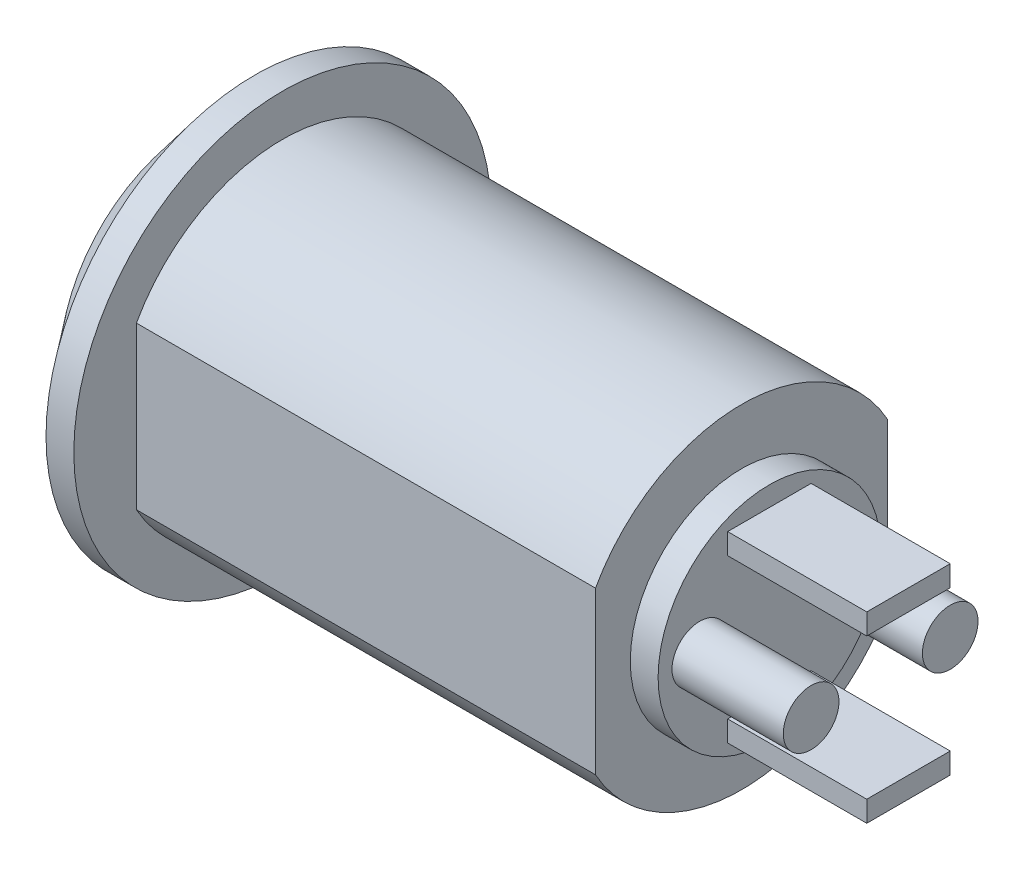
ISO-10303-21;
HEADER;
FILE_DESCRIPTION(('STEP AP214'),'2;1');
FILE_NAME('part.step','',(''),(''),'','','');
FILE_SCHEMA(('AUTOMOTIVE_DESIGN { 1 0 10303 214 1 1 1 1 }'));
ENDSEC;
DATA;
#1=APPLICATION_CONTEXT('core data for automotive mechanical design processes');
#2=APPLICATION_PROTOCOL_DEFINITION('international standard','automotive_design',2000,#1);
#3=PRODUCT_CONTEXT('',#1,'mechanical');
#4=PRODUCT('Part','Part','',(#3));
#5=PRODUCT_RELATED_PRODUCT_CATEGORY('part','',(#4));
#6=PRODUCT_DEFINITION_FORMATION('','',#4);
#7=PRODUCT_DEFINITION_CONTEXT('part definition',#1,'design');
#8=PRODUCT_DEFINITION('design','',#6,#7);
#9=PRODUCT_DEFINITION_SHAPE('','',#8);
#10=(LENGTH_UNIT() NAMED_UNIT(*) SI_UNIT(.MILLI.,.METRE.));
#11=(NAMED_UNIT(*) PLANE_ANGLE_UNIT() SI_UNIT($,.RADIAN.));
#12=(NAMED_UNIT(*) SI_UNIT($,.STERADIAN.) SOLID_ANGLE_UNIT());
#13=UNCERTAINTY_MEASURE_WITH_UNIT(LENGTH_MEASURE(1.E-05),#10,'distance_accuracy_value','');
#14=(GEOMETRIC_REPRESENTATION_CONTEXT(3) GLOBAL_UNCERTAINTY_ASSIGNED_CONTEXT((#13)) GLOBAL_UNIT_ASSIGNED_CONTEXT((#10,
#11,#12)) REPRESENTATION_CONTEXT('',''));
#15=CARTESIAN_POINT('',(0.,0.,0.));
#16=DIRECTION('',(0.,0.,1.));
#17=DIRECTION('',(1.,0.,0.));
#18=AXIS2_PLACEMENT_3D('',#15,#16,#17);
#19=CARTESIAN_POINT('',(20.5,4.,0.));
#20=DIRECTION('',(-1.,0.,0.));
#21=DIRECTION('',(0.,0.,1.));
#22=AXIS2_PLACEMENT_3D('',#19,#20,#21);
#23=PLANE('',#22);
#24=CARTESIAN_POINT('',(20.5,0.,2.5));
#25=DIRECTION('',(-1.,0.,0.));
#26=DIRECTION('',(0.,0.,1.));
#27=AXIS2_PLACEMENT_3D('',#24,#25,#26);
#28=CIRCLE('',#27,1.);
#29=CARTESIAN_POINT('',(20.5,0.,3.5));
#30=VERTEX_POINT('',#29);
#31=EDGE_CURVE('E43',#30,#30,#28,.F.);
#32=ORIENTED_EDGE('',*,*,#31,.F.);
#33=EDGE_LOOP('',(#32));
#34=FACE_BOUND('',#33,.T.);
#35=DIRECTION('',(0.,-1.,0.));
#36=VECTOR('',#35,1.);
#37=CARTESIAN_POINT('',(20.5,3.29,1.5));
#38=LINE('',#37,#36);
#39=CARTESIAN_POINT('',(20.5,3.29,1.5));
#40=VERTEX_POINT('',#39);
#41=CARTESIAN_POINT('',(20.5,2.54,1.5));
#42=VERTEX_POINT('',#41);
#43=EDGE_CURVE('E169',#40,#42,#38,.T.);
#44=ORIENTED_EDGE('',*,*,#43,.F.);
#45=DIRECTION('',(0.,0.,1.));
#46=VECTOR('',#45,1.);
#47=CARTESIAN_POINT('',(20.5,3.29,1.5));
#48=LINE('',#47,#46);
#49=CARTESIAN_POINT('',(20.5,3.29,-1.5));
#50=VERTEX_POINT('',#49);
#51=EDGE_CURVE('E182',#50,#40,#48,.T.);
#52=ORIENTED_EDGE('',*,*,#51,.F.);
#53=DIRECTION('',(0.,1.,0.));
#54=VECTOR('',#53,1.);
#55=CARTESIAN_POINT('',(20.5,3.29,-1.5));
#56=LINE('',#55,#54);
#57=CARTESIAN_POINT('',(20.5,2.54,-1.5));
#58=VERTEX_POINT('',#57);
#59=EDGE_CURVE('E191',#58,#50,#56,.T.);
#60=ORIENTED_EDGE('',*,*,#59,.F.);
#61=DIRECTION('',(0.,0.,-1.));
#62=VECTOR('',#61,1.);
#63=CARTESIAN_POINT('',(20.5,2.54,1.5));
#64=LINE('',#63,#62);
#65=EDGE_CURVE('E172',#42,#58,#64,.T.);
#66=ORIENTED_EDGE('',*,*,#65,.F.);
#67=EDGE_LOOP('',(#44,#52,#60,#66));
#68=FACE_BOUND('',#67,.T.);
#69=CARTESIAN_POINT('',(20.5,0.,0.));
#70=DIRECTION('',(-1.,0.,0.));
#71=DIRECTION('',(0.,0.,1.));
#72=AXIS2_PLACEMENT_3D('',#69,#70,#71);
#73=CIRCLE('',#72,4.);
#74=CARTESIAN_POINT('',(20.5,0.,4.));
#75=VERTEX_POINT('',#74);
#76=EDGE_CURVE('E256',#75,#75,#73,.T.);
#77=ORIENTED_EDGE('',*,*,#76,.F.);
#78=EDGE_LOOP('',(#77));
#79=FACE_BOUND('',#78,.T.);
#80=DIRECTION('',(0.,0.,-1.));
#81=VECTOR('',#80,1.);
#82=CARTESIAN_POINT('',(20.5,-3.29,1.5));
#83=LINE('',#82,#81);
#84=CARTESIAN_POINT('',(20.5,-3.29,1.5));
#85=VERTEX_POINT('',#84);
#86=CARTESIAN_POINT('',(20.5,-3.29,-1.5));
#87=VERTEX_POINT('',#86);
#88=EDGE_CURVE('E168',#85,#87,#83,.T.);
#89=ORIENTED_EDGE('',*,*,#88,.F.);
#90=DIRECTION('',(0.,-1.,0.));
#91=VECTOR('',#90,1.);
#92=CARTESIAN_POINT('',(20.5,-3.29,1.5));
#93=LINE('',#92,#91);
#94=CARTESIAN_POINT('',(20.5,-2.54,1.5));
#95=VERTEX_POINT('',#94);
#96=EDGE_CURVE('E165',#95,#85,#93,.T.);
#97=ORIENTED_EDGE('',*,*,#96,.F.);
#98=DIRECTION('',(0.,0.,1.));
#99=VECTOR('',#98,1.);
#100=CARTESIAN_POINT('',(20.5,-2.54,1.5));
#101=LINE('',#100,#99);
#102=CARTESIAN_POINT('',(20.5,-2.54,-1.5));
#103=VERTEX_POINT('',#102);
#104=EDGE_CURVE('E55',#103,#95,#101,.T.);
#105=ORIENTED_EDGE('',*,*,#104,.F.);
#106=DIRECTION('',(0.,1.,0.));
#107=VECTOR('',#106,1.);
#108=CARTESIAN_POINT('',(20.5,-3.29,-1.5));
#109=LINE('',#108,#107);
#110=EDGE_CURVE('E50',#87,#103,#109,.T.);
#111=ORIENTED_EDGE('',*,*,#110,.F.);
#112=EDGE_LOOP('',(#89,#97,#105,#111));
#113=FACE_BOUND('',#112,.T.);
#114=CARTESIAN_POINT('',(20.5,0.,-2.5));
#115=DIRECTION('',(-1.,0.,0.));
#116=DIRECTION('',(0.,0.,1.));
#117=AXIS2_PLACEMENT_3D('',#114,#115,#116);
#118=CIRCLE('',#117,1.);
#119=CARTESIAN_POINT('',(20.5,0.,-1.5));
#120=VERTEX_POINT('',#119);
#121=EDGE_CURVE('E11',#120,#120,#118,.F.);
#122=ORIENTED_EDGE('',*,*,#121,.F.);
#123=EDGE_LOOP('',(#122));
#124=FACE_BOUND('',#123,.T.);
#125=ADVANCED_FACE('F35',(#34,#68,#79,#113,#124),#23,.F.);
#126=CARTESIAN_POINT('',(0.,0.,0.));
#127=DIRECTION('',(-1.,0.,0.));
#128=DIRECTION('',(0.,0.,1.));
#129=AXIS2_PLACEMENT_3D('',#126,#127,#128);
#130=CYLINDRICAL_SURFACE('',#129,6.);
#131=CARTESIAN_POINT('',(19.5,0.,0.));
#132=DIRECTION('',(-1.,0.,0.));
#133=DIRECTION('',(0.,0.,1.));
#134=AXIS2_PLACEMENT_3D('',#131,#132,#133);
#135=CIRCLE('',#134,6.);
#136=CARTESIAN_POINT('',(19.5,2.90473750965556,5.25));
#137=VERTEX_POINT('',#136);
#138=CARTESIAN_POINT('',(19.5,2.90473750965556,-5.25));
#139=VERTEX_POINT('',#138);
#140=EDGE_CURVE('E263',#137,#139,#135,.T.);
#141=ORIENTED_EDGE('',*,*,#140,.T.);
#142=DIRECTION('',(-1.,0.,0.));
#143=VECTOR('',#142,1.);
#144=CARTESIAN_POINT('',(0.,2.90473750965556,-5.25));
#145=LINE('',#144,#143);
#146=CARTESIAN_POINT('',(3.,2.90473750965556,-5.25));
#147=VERTEX_POINT('',#146);
#148=EDGE_CURVE('E213',#139,#147,#145,.T.);
#149=ORIENTED_EDGE('',*,*,#148,.T.);
#150=CARTESIAN_POINT('',(3.,0.,0.));
#151=DIRECTION('',(-1.,0.,0.));
#152=DIRECTION('',(0.,0.,1.));
#153=AXIS2_PLACEMENT_3D('',#150,#151,#152);
#154=CIRCLE('',#153,6.);
#155=CARTESIAN_POINT('',(3.,2.90473750965556,5.25));
#156=VERTEX_POINT('',#155);
#157=EDGE_CURVE('E267',#156,#147,#154,.T.);
#158=ORIENTED_EDGE('',*,*,#157,.F.);
#159=DIRECTION('',(-1.,0.,0.));
#160=VECTOR('',#159,1.);
#161=CARTESIAN_POINT('',(0.,2.90473750965556,5.25));
#162=LINE('',#161,#160);
#163=EDGE_CURVE('E219',#156,#137,#162,.F.);
#164=ORIENTED_EDGE('',*,*,#163,.T.);
#165=EDGE_LOOP('',(#141,#149,#158,#164));
#166=FACE_BOUND('',#165,.T.);
#167=ADVANCED_FACE('F291',(#166),#130,.T.);
#168=CARTESIAN_POINT('',(0.,0.,0.));
#169=DIRECTION('',(1.,0.,0.));
#170=DIRECTION('',(0.,0.,-1.));
#171=AXIS2_PLACEMENT_3D('',#168,#169,#170);
#172=PLANE('',#171);
#173=CARTESIAN_POINT('',(0.,0.,0.));
#174=DIRECTION('',(-1.,0.,0.));
#175=DIRECTION('',(0.,0.,1.));
#176=AXIS2_PLACEMENT_3D('',#173,#174,#175);
#177=CIRCLE('',#176,5.);
#178=CARTESIAN_POINT('',(0.,0.,5.));
#179=VERTEX_POINT('',#178);
#180=EDGE_CURVE('E276',#179,#179,#177,.T.);
#181=ORIENTED_EDGE('',*,*,#180,.T.);
#182=EDGE_LOOP('',(#181));
#183=FACE_BOUND('',#182,.T.);
#184=DIRECTION('',(0.,1.,0.));
#185=VECTOR('',#184,1.);
#186=CARTESIAN_POINT('',(0.,3.25,-0.999999999999999));
#187=LINE('',#186,#185);
#188=CARTESIAN_POINT('',(0.,-3.25,-1.));
#189=VERTEX_POINT('',#188);
#190=CARTESIAN_POINT('',(0.,3.25,-0.999999999999999));
#191=VERTEX_POINT('',#190);
#192=EDGE_CURVE('E225',#189,#191,#187,.T.);
#193=ORIENTED_EDGE('',*,*,#192,.T.);
#194=DIRECTION('',(0.,0.,1.));
#195=VECTOR('',#194,1.);
#196=CARTESIAN_POINT('',(0.,3.25,-0.999999999999999));
#197=LINE('',#196,#195);
#198=CARTESIAN_POINT('',(0.,3.25,0.999999999999999));
#199=VERTEX_POINT('',#198);
#200=EDGE_CURVE('E239',#191,#199,#197,.T.);
#201=ORIENTED_EDGE('',*,*,#200,.T.);
#202=DIRECTION('',(0.,-1.,0.));
#203=VECTOR('',#202,1.);
#204=CARTESIAN_POINT('',(0.,3.25,0.999999999999999));
#205=LINE('',#204,#203);
#206=CARTESIAN_POINT('',(0.,-3.25,1.));
#207=VERTEX_POINT('',#206);
#208=EDGE_CURVE('E242',#199,#207,#205,.T.);
#209=ORIENTED_EDGE('',*,*,#208,.T.);
#210=DIRECTION('',(0.,0.,-1.));
#211=VECTOR('',#210,1.);
#212=CARTESIAN_POINT('',(0.,-3.25,-1.));
#213=LINE('',#212,#211);
#214=EDGE_CURVE('E230',#207,#189,#213,.T.);
#215=ORIENTED_EDGE('',*,*,#214,.T.);
#216=EDGE_LOOP('',(#193,#201,#209,#215));
#217=FACE_BOUND('',#216,.T.);
#218=ADVANCED_FACE('F37',(#183,#217),#172,.F.);
#219=CARTESIAN_POINT('',(2.,0.,0.));
#220=DIRECTION('',(1.,0.,0.));
#221=DIRECTION('',(0.,0.,-1.));
#222=AXIS2_PLACEMENT_3D('',#219,#220,#221);
#223=CONICAL_SURFACE('',#222,7.5,0.896055384571344);
#224=ORIENTED_EDGE('',*,*,#180,.F.);
#225=EDGE_LOOP('',(#224));
#226=FACE_BOUND('',#225,.T.);
#227=CARTESIAN_POINT('',(2.,0.,0.));
#228=DIRECTION('',(-1.,0.,0.));
#229=DIRECTION('',(0.,0.,1.));
#230=AXIS2_PLACEMENT_3D('',#227,#228,#229);
#231=CIRCLE('',#230,7.5);
#232=CARTESIAN_POINT('',(2.,0.,7.5));
#233=VERTEX_POINT('',#232);
#234=EDGE_CURVE('E273',#233,#233,#231,.T.);
#235=ORIENTED_EDGE('',*,*,#234,.T.);
#236=EDGE_LOOP('',(#235));
#237=FACE_BOUND('',#236,.T.);
#238=ADVANCED_FACE('F398',(#226,#237),#223,.T.);
#239=CARTESIAN_POINT('',(0.,0.,0.));
#240=DIRECTION('',(-1.,0.,0.));
#241=DIRECTION('',(0.,0.,1.));
#242=AXIS2_PLACEMENT_3D('',#239,#240,#241);
#243=CYLINDRICAL_SURFACE('',#242,7.5);
#244=ORIENTED_EDGE('',*,*,#234,.F.);
#245=EDGE_LOOP('',(#244));
#246=FACE_BOUND('',#245,.T.);
#247=CARTESIAN_POINT('',(3.,0.,0.));
#248=DIRECTION('',(-1.,0.,0.));
#249=DIRECTION('',(0.,0.,1.));
#250=AXIS2_PLACEMENT_3D('',#247,#248,#249);
#251=CIRCLE('',#250,7.5);
#252=CARTESIAN_POINT('',(3.,0.,7.5));
#253=VERTEX_POINT('',#252);
#254=EDGE_CURVE('E270',#253,#253,#251,.T.);
#255=ORIENTED_EDGE('',*,*,#254,.T.);
#256=EDGE_LOOP('',(#255));
#257=FACE_BOUND('',#256,.T.);
#258=ADVANCED_FACE('F395',(#246,#257),#243,.T.);
#259=CARTESIAN_POINT('',(3.,7.5,0.));
#260=DIRECTION('',(-1.,0.,0.));
#261=DIRECTION('',(0.,0.,1.));
#262=AXIS2_PLACEMENT_3D('',#259,#260,#261);
#263=PLANE('',#262);
#264=DIRECTION('',(0.,-1.,0.));
#265=VECTOR('',#264,1.);
#266=CARTESIAN_POINT('',(3.,9.86352242437104,-5.25));
#267=LINE('',#266,#265);
#268=CARTESIAN_POINT('',(3.,-2.90473750965556,-5.25));
#269=VERTEX_POINT('',#268);
#270=EDGE_CURVE('E207',#147,#269,#267,.T.);
#271=ORIENTED_EDGE('',*,*,#270,.T.);
#272=CARTESIAN_POINT('',(3.,-2.90473750965557,5.25));
#273=VERTEX_POINT('',#272);
#274=EDGE_CURVE('E266',#269,#273,#154,.T.);
#275=ORIENTED_EDGE('',*,*,#274,.T.);
#276=DIRECTION('',(0.,1.,0.));
#277=VECTOR('',#276,1.);
#278=CARTESIAN_POINT('',(3.,9.86352242437104,5.25));
#279=LINE('',#278,#277);
#280=EDGE_CURVE('E216',#273,#156,#279,.T.);
#281=ORIENTED_EDGE('',*,*,#280,.T.);
#282=ORIENTED_EDGE('',*,*,#157,.T.);
#283=EDGE_LOOP('',(#271,#275,#281,#282));
#284=FACE_BOUND('',#283,.T.);
#285=ORIENTED_EDGE('',*,*,#254,.F.);
#286=EDGE_LOOP('',(#285));
#287=FACE_BOUND('',#286,.T.);
#288=ADVANCED_FACE('F391',(#284,#287),#263,.F.);
#289=ORIENTED_EDGE('',*,*,#274,.F.);
#290=DIRECTION('',(-1.,0.,0.));
#291=VECTOR('',#290,1.);
#292=CARTESIAN_POINT('',(0.,-2.90473750965556,-5.25));
#293=LINE('',#292,#291);
#294=CARTESIAN_POINT('',(19.5,-2.90473750965556,-5.25));
#295=VERTEX_POINT('',#294);
#296=EDGE_CURVE('E210',#269,#295,#293,.F.);
#297=ORIENTED_EDGE('',*,*,#296,.T.);
#298=CARTESIAN_POINT('',(19.5,-2.90473750965557,5.25));
#299=VERTEX_POINT('',#298);
#300=EDGE_CURVE('E262',#295,#299,#135,.T.);
#301=ORIENTED_EDGE('',*,*,#300,.T.);
#302=DIRECTION('',(-1.,0.,0.));
#303=VECTOR('',#302,1.);
#304=CARTESIAN_POINT('',(0.,-2.90473750965557,5.25));
#305=LINE('',#304,#303);
#306=EDGE_CURVE('E222',#299,#273,#305,.T.);
#307=ORIENTED_EDGE('',*,*,#306,.T.);
#308=EDGE_LOOP('',(#289,#297,#301,#307));
#309=FACE_BOUND('',#308,.T.);
#310=ADVANCED_FACE('F387',(#309),#130,.T.);
#311=CARTESIAN_POINT('',(19.5,6.,0.));
#312=DIRECTION('',(-1.,0.,0.));
#313=DIRECTION('',(0.,0.,1.));
#314=AXIS2_PLACEMENT_3D('',#311,#312,#313);
#315=PLANE('',#314);
#316=ORIENTED_EDGE('',*,*,#300,.F.);
#317=DIRECTION('',(0.,1.,0.));
#318=VECTOR('',#317,1.);
#319=CARTESIAN_POINT('',(19.5,6.,-5.25));
#320=LINE('',#319,#318);
#321=EDGE_CURVE('E282',#295,#139,#320,.T.);
#322=ORIENTED_EDGE('',*,*,#321,.T.);
#323=ORIENTED_EDGE('',*,*,#140,.F.);
#324=DIRECTION('',(0.,-1.,0.));
#325=VECTOR('',#324,1.);
#326=CARTESIAN_POINT('',(19.5,6.,5.25));
#327=LINE('',#326,#325);
#328=EDGE_CURVE('E279',#137,#299,#327,.T.);
#329=ORIENTED_EDGE('',*,*,#328,.T.);
#330=EDGE_LOOP('',(#316,#322,#323,#329));
#331=FACE_BOUND('',#330,.T.);
#332=CARTESIAN_POINT('',(19.5,0.,0.));
#333=DIRECTION('',(-1.,0.,0.));
#334=DIRECTION('',(0.,0.,1.));
#335=AXIS2_PLACEMENT_3D('',#332,#333,#334);
#336=CIRCLE('',#335,4.);
#337=CARTESIAN_POINT('',(19.5,0.,4.));
#338=VERTEX_POINT('',#337);
#339=EDGE_CURVE('E259',#338,#338,#336,.T.);
#340=ORIENTED_EDGE('',*,*,#339,.T.);
#341=EDGE_LOOP('',(#340));
#342=FACE_BOUND('',#341,.T.);
#343=ADVANCED_FACE('F383',(#331,#342),#315,.F.);
#344=CARTESIAN_POINT('',(0.,0.,0.));
#345=DIRECTION('',(-1.,0.,0.));
#346=DIRECTION('',(0.,0.,1.));
#347=AXIS2_PLACEMENT_3D('',#344,#345,#346);
#348=CYLINDRICAL_SURFACE('',#347,4.);
#349=ORIENTED_EDGE('',*,*,#339,.F.);
#350=EDGE_LOOP('',(#349));
#351=FACE_BOUND('',#350,.T.);
#352=ORIENTED_EDGE('',*,*,#76,.T.);
#353=EDGE_LOOP('',(#352));
#354=FACE_BOUND('',#353,.T.);
#355=ADVANCED_FACE('F378',(#351,#354),#348,.T.);
#356=CARTESIAN_POINT('',(10.,3.25,-0.999999999999999));
#357=DIRECTION('',(0.,0.,1.));
#358=DIRECTION('',(0.,-1.,0.));
#359=AXIS2_PLACEMENT_3D('',#356,#357,#358);
#360=PLANE('',#359);
#361=ORIENTED_EDGE('',*,*,#192,.F.);
#362=DIRECTION('',(-1.,0.,0.));
#363=VECTOR('',#362,1.);
#364=CARTESIAN_POINT('',(10.,-3.25,-1.));
#365=LINE('',#364,#363);
#366=CARTESIAN_POINT('',(10.,-3.25,-1.));
#367=VERTEX_POINT('',#366);
#368=EDGE_CURVE('E236',#367,#189,#365,.T.);
#369=ORIENTED_EDGE('',*,*,#368,.F.);
#370=DIRECTION('',(0.,1.,0.));
#371=VECTOR('',#370,1.);
#372=CARTESIAN_POINT('',(10.,3.25,-0.999999999999999));
#373=LINE('',#372,#371);
#374=CARTESIAN_POINT('',(10.,3.25,-0.999999999999999));
#375=VERTEX_POINT('',#374);
#376=EDGE_CURVE('E226',#367,#375,#373,.T.);
#377=ORIENTED_EDGE('',*,*,#376,.T.);
#378=DIRECTION('',(-1.,0.,0.));
#379=VECTOR('',#378,1.);
#380=CARTESIAN_POINT('',(10.,3.25,-0.999999999999999));
#381=LINE('',#380,#379);
#382=EDGE_CURVE('E253',#375,#191,#381,.T.);
#383=ORIENTED_EDGE('',*,*,#382,.T.);
#384=EDGE_LOOP('',(#361,#369,#377,#383));
#385=FACE_BOUND('',#384,.T.);
#386=ADVANCED_FACE('F375',(#385),#360,.T.);
#387=CARTESIAN_POINT('',(10.,3.25,-0.999999999999999));
#388=DIRECTION('',(0.,-1.,0.));
#389=DIRECTION('',(0.,0.,-1.));
#390=AXIS2_PLACEMENT_3D('',#387,#388,#389);
#391=PLANE('',#390);
#392=ORIENTED_EDGE('',*,*,#200,.F.);
#393=ORIENTED_EDGE('',*,*,#382,.F.);
#394=DIRECTION('',(0.,0.,1.));
#395=VECTOR('',#394,1.);
#396=CARTESIAN_POINT('',(10.,3.25,-0.999999999999999));
#397=LINE('',#396,#395);
#398=CARTESIAN_POINT('',(10.,3.25,0.999999999999999));
#399=VERTEX_POINT('',#398);
#400=EDGE_CURVE('E229',#375,#399,#397,.T.);
#401=ORIENTED_EDGE('',*,*,#400,.T.);
#402=DIRECTION('',(-1.,0.,0.));
#403=VECTOR('',#402,1.);
#404=CARTESIAN_POINT('',(10.,3.25,0.999999999999999));
#405=LINE('',#404,#403);
#406=EDGE_CURVE('E251',#399,#199,#405,.T.);
#407=ORIENTED_EDGE('',*,*,#406,.T.);
#408=EDGE_LOOP('',(#392,#393,#401,#407));
#409=FACE_BOUND('',#408,.T.);
#410=ADVANCED_FACE('F371',(#409),#391,.T.);
#411=CARTESIAN_POINT('',(10.,3.25,0.999999999999999));
#412=DIRECTION('',(0.,0.,-1.));
#413=DIRECTION('',(0.,1.,0.));
#414=AXIS2_PLACEMENT_3D('',#411,#412,#413);
#415=PLANE('',#414);
#416=ORIENTED_EDGE('',*,*,#208,.F.);
#417=ORIENTED_EDGE('',*,*,#406,.F.);
#418=DIRECTION('',(0.,-1.,0.));
#419=VECTOR('',#418,1.);
#420=CARTESIAN_POINT('',(10.,3.25,0.999999999999999));
#421=LINE('',#420,#419);
#422=CARTESIAN_POINT('',(10.,-3.25,1.));
#423=VERTEX_POINT('',#422);
#424=EDGE_CURVE('E232',#399,#423,#421,.T.);
#425=ORIENTED_EDGE('',*,*,#424,.T.);
#426=DIRECTION('',(-1.,0.,0.));
#427=VECTOR('',#426,1.);
#428=CARTESIAN_POINT('',(10.,-3.25,1.));
#429=LINE('',#428,#427);
#430=EDGE_CURVE('E249',#423,#207,#429,.T.);
#431=ORIENTED_EDGE('',*,*,#430,.T.);
#432=EDGE_LOOP('',(#416,#417,#425,#431));
#433=FACE_BOUND('',#432,.T.);
#434=ADVANCED_FACE('F367',(#433),#415,.T.);
#435=CARTESIAN_POINT('',(10.,-3.25,-1.));
#436=DIRECTION('',(0.,1.,0.));
#437=DIRECTION('',(0.,0.,1.));
#438=AXIS2_PLACEMENT_3D('',#435,#436,#437);
#439=PLANE('',#438);
#440=ORIENTED_EDGE('',*,*,#214,.F.);
#441=ORIENTED_EDGE('',*,*,#430,.F.);
#442=DIRECTION('',(0.,0.,-1.));
#443=VECTOR('',#442,1.);
#444=CARTESIAN_POINT('',(10.,-3.25,-1.));
#445=LINE('',#444,#443);
#446=EDGE_CURVE('E234',#423,#367,#445,.T.);
#447=ORIENTED_EDGE('',*,*,#446,.T.);
#448=ORIENTED_EDGE('',*,*,#368,.T.);
#449=EDGE_LOOP('',(#440,#441,#447,#448));
#450=FACE_BOUND('',#449,.T.);
#451=ADVANCED_FACE('F363',(#450),#439,.T.);
#452=CARTESIAN_POINT('',(10.,0.,0.));
#453=DIRECTION('',(-1.,0.,0.));
#454=DIRECTION('',(0.,0.,1.));
#455=AXIS2_PLACEMENT_3D('',#452,#453,#454);
#456=PLANE('',#455);
#457=ORIENTED_EDGE('',*,*,#376,.F.);
#458=ORIENTED_EDGE('',*,*,#446,.F.);
#459=ORIENTED_EDGE('',*,*,#424,.F.);
#460=ORIENTED_EDGE('',*,*,#400,.F.);
#461=EDGE_LOOP('',(#457,#458,#459,#460));
#462=FACE_BOUND('',#461,.T.);
#463=ADVANCED_FACE('F359',(#462),#456,.T.);
#464=CARTESIAN_POINT('',(-16.3247091121031,9.86352242437104,5.25));
#465=DIRECTION('',(0.,0.,-1.));
#466=DIRECTION('',(0.,1.,0.));
#467=AXIS2_PLACEMENT_3D('',#464,#465,#466);
#468=PLANE('',#467);
#469=ORIENTED_EDGE('',*,*,#328,.F.);
#470=ORIENTED_EDGE('',*,*,#163,.F.);
#471=ORIENTED_EDGE('',*,*,#280,.F.);
#472=ORIENTED_EDGE('',*,*,#306,.F.);
#473=EDGE_LOOP('',(#469,#470,#471,#472));
#474=FACE_BOUND('',#473,.T.);
#475=ADVANCED_FACE('F355',(#474),#468,.F.);
#476=CARTESIAN_POINT('',(-16.3247091121031,9.86352242437104,-5.25));
#477=DIRECTION('',(0.,0.,1.));
#478=DIRECTION('',(0.,-1.,0.));
#479=AXIS2_PLACEMENT_3D('',#476,#477,#478);
#480=PLANE('',#479);
#481=ORIENTED_EDGE('',*,*,#321,.F.);
#482=ORIENTED_EDGE('',*,*,#296,.F.);
#483=ORIENTED_EDGE('',*,*,#270,.F.);
#484=ORIENTED_EDGE('',*,*,#148,.F.);
#485=EDGE_LOOP('',(#481,#482,#483,#484));
#486=FACE_BOUND('',#485,.T.);
#487=ADVANCED_FACE('F351',(#486),#480,.F.);
#488=CARTESIAN_POINT('',(25.5,3.29,1.5));
#489=DIRECTION('',(0.,0.,-1.));
#490=DIRECTION('',(0.,1.,0.));
#491=AXIS2_PLACEMENT_3D('',#488,#489,#490);
#492=PLANE('',#491);
#493=ORIENTED_EDGE('',*,*,#43,.T.);
#494=DIRECTION('',(-1.,0.,0.));
#495=VECTOR('',#494,1.);
#496=CARTESIAN_POINT('',(25.5,2.54,1.5));
#497=LINE('',#496,#495);
#498=CARTESIAN_POINT('',(25.5,2.54,1.5));
#499=VERTEX_POINT('',#498);
#500=EDGE_CURVE('E204',#499,#42,#497,.T.);
#501=ORIENTED_EDGE('',*,*,#500,.F.);
#502=DIRECTION('',(0.,-1.,0.));
#503=VECTOR('',#502,1.);
#504=CARTESIAN_POINT('',(25.5,3.29,1.5));
#505=LINE('',#504,#503);
#506=CARTESIAN_POINT('',(25.5,3.29,1.5));
#507=VERTEX_POINT('',#506);
#508=EDGE_CURVE('E178',#507,#499,#505,.T.);
#509=ORIENTED_EDGE('',*,*,#508,.F.);
#510=DIRECTION('',(-1.,0.,0.));
#511=VECTOR('',#510,1.);
#512=CARTESIAN_POINT('',(25.5,3.29,1.5));
#513=LINE('',#512,#511);
#514=EDGE_CURVE('E187',#507,#40,#513,.T.);
#515=ORIENTED_EDGE('',*,*,#514,.T.);
#516=EDGE_LOOP('',(#493,#501,#509,#515));
#517=FACE_BOUND('',#516,.T.);
#518=ADVANCED_FACE('F347',(#517),#492,.F.);
#519=CARTESIAN_POINT('',(25.5,2.54,1.5));
#520=DIRECTION('',(0.,1.,0.));
#521=DIRECTION('',(0.,0.,1.));
#522=AXIS2_PLACEMENT_3D('',#519,#520,#521);
#523=PLANE('',#522);
#524=ORIENTED_EDGE('',*,*,#65,.T.);
#525=DIRECTION('',(-1.,0.,0.));
#526=VECTOR('',#525,1.);
#527=CARTESIAN_POINT('',(25.5,2.54,-1.5));
#528=LINE('',#527,#526);
#529=CARTESIAN_POINT('',(25.5,2.54,-1.5));
#530=VERTEX_POINT('',#529);
#531=EDGE_CURVE('E201',#530,#58,#528,.T.);
#532=ORIENTED_EDGE('',*,*,#531,.F.);
#533=DIRECTION('',(0.,0.,-1.));
#534=VECTOR('',#533,1.);
#535=CARTESIAN_POINT('',(25.5,2.54,1.5));
#536=LINE('',#535,#534);
#537=EDGE_CURVE('E181',#499,#530,#536,.T.);
#538=ORIENTED_EDGE('',*,*,#537,.F.);
#539=ORIENTED_EDGE('',*,*,#500,.T.);
#540=EDGE_LOOP('',(#524,#532,#538,#539));
#541=FACE_BOUND('',#540,.T.);
#542=ADVANCED_FACE('F343',(#541),#523,.F.);
#543=CARTESIAN_POINT('',(25.5,3.29,-1.5));
#544=DIRECTION('',(0.,0.,1.));
#545=DIRECTION('',(0.,-1.,0.));
#546=AXIS2_PLACEMENT_3D('',#543,#544,#545);
#547=PLANE('',#546);
#548=ORIENTED_EDGE('',*,*,#59,.T.);
#549=DIRECTION('',(-1.,0.,0.));
#550=VECTOR('',#549,1.);
#551=CARTESIAN_POINT('',(25.5,3.29,-1.5));
#552=LINE('',#551,#550);
#553=CARTESIAN_POINT('',(25.5,3.29,-1.5));
#554=VERTEX_POINT('',#553);
#555=EDGE_CURVE('E198',#554,#50,#552,.T.);
#556=ORIENTED_EDGE('',*,*,#555,.F.);
#557=DIRECTION('',(0.,1.,0.));
#558=VECTOR('',#557,1.);
#559=CARTESIAN_POINT('',(25.5,3.29,-1.5));
#560=LINE('',#559,#558);
#561=EDGE_CURVE('E184',#530,#554,#560,.T.);
#562=ORIENTED_EDGE('',*,*,#561,.F.);
#563=ORIENTED_EDGE('',*,*,#531,.T.);
#564=EDGE_LOOP('',(#548,#556,#562,#563));
#565=FACE_BOUND('',#564,.T.);
#566=ADVANCED_FACE('F339',(#565),#547,.F.);
#567=CARTESIAN_POINT('',(25.5,3.29,1.5));
#568=DIRECTION('',(0.,-1.,0.));
#569=DIRECTION('',(0.,0.,-1.));
#570=AXIS2_PLACEMENT_3D('',#567,#568,#569);
#571=PLANE('',#570);
#572=ORIENTED_EDGE('',*,*,#51,.T.);
#573=ORIENTED_EDGE('',*,*,#514,.F.);
#574=DIRECTION('',(0.,0.,1.));
#575=VECTOR('',#574,1.);
#576=CARTESIAN_POINT('',(25.5,3.29,1.5));
#577=LINE('',#576,#575);
#578=EDGE_CURVE('E186',#554,#507,#577,.T.);
#579=ORIENTED_EDGE('',*,*,#578,.F.);
#580=ORIENTED_EDGE('',*,*,#555,.T.);
#581=EDGE_LOOP('',(#572,#573,#579,#580));
#582=FACE_BOUND('',#581,.T.);
#583=ADVANCED_FACE('F335',(#582),#571,.F.);
#584=CARTESIAN_POINT('',(25.5,0.,0.));
#585=DIRECTION('',(1.,0.,0.));
#586=DIRECTION('',(0.,0.,-1.));
#587=AXIS2_PLACEMENT_3D('',#584,#585,#586);
#588=PLANE('',#587);
#589=ORIENTED_EDGE('',*,*,#508,.T.);
#590=ORIENTED_EDGE('',*,*,#537,.T.);
#591=ORIENTED_EDGE('',*,*,#561,.T.);
#592=ORIENTED_EDGE('',*,*,#578,.T.);
#593=EDGE_LOOP('',(#589,#590,#591,#592));
#594=FACE_BOUND('',#593,.T.);
#595=ADVANCED_FACE('F332',(#594),#588,.T.);
#596=CARTESIAN_POINT('',(25.5,-3.29,1.5));
#597=DIRECTION('',(0.,1.,0.));
#598=DIRECTION('',(0.,0.,1.));
#599=AXIS2_PLACEMENT_3D('',#596,#597,#598);
#600=PLANE('',#599);
#601=ORIENTED_EDGE('',*,*,#88,.T.);
#602=DIRECTION('',(-1.,0.,0.));
#603=VECTOR('',#602,1.);
#604=CARTESIAN_POINT('',(25.5,-3.29,-1.5));
#605=LINE('',#604,#603);
#606=CARTESIAN_POINT('',(25.5,-3.29,-1.5));
#607=VERTEX_POINT('',#606);
#608=EDGE_CURVE('E149',#607,#87,#605,.T.);
#609=ORIENTED_EDGE('',*,*,#608,.F.);
#610=DIRECTION('',(0.,0.,-1.));
#611=VECTOR('',#610,1.);
#612=CARTESIAN_POINT('',(25.5,-3.29,1.5));
#613=LINE('',#612,#611);
#614=CARTESIAN_POINT('',(25.5,-3.29,1.5));
#615=VERTEX_POINT('',#614);
#616=EDGE_CURVE('E156',#615,#607,#613,.T.);
#617=ORIENTED_EDGE('',*,*,#616,.F.);
#618=DIRECTION('',(-1.,0.,0.));
#619=VECTOR('',#618,1.);
#620=CARTESIAN_POINT('',(25.5,-3.29,1.5));
#621=LINE('',#620,#619);
#622=EDGE_CURVE('E622',#615,#85,#621,.T.);
#623=ORIENTED_EDGE('',*,*,#622,.T.);
#624=EDGE_LOOP('',(#601,#609,#617,#623));
#625=FACE_BOUND('',#624,.T.);
#626=ADVANCED_FACE('F167',(#625),#600,.F.);
#627=CARTESIAN_POINT('',(25.5,-3.29,-1.5));
#628=DIRECTION('',(0.,0.,1.));
#629=DIRECTION('',(0.,-1.,0.));
#630=AXIS2_PLACEMENT_3D('',#627,#628,#629);
#631=PLANE('',#630);
#632=ORIENTED_EDGE('',*,*,#110,.T.);
#633=DIRECTION('',(-1.,0.,0.));
#634=VECTOR('',#633,1.);
#635=CARTESIAN_POINT('',(25.5,-2.54,-1.5));
#636=LINE('',#635,#634);
#637=CARTESIAN_POINT('',(25.5,-2.54,-1.5));
#638=VERTEX_POINT('',#637);
#639=EDGE_CURVE('E152',#638,#103,#636,.T.);
#640=ORIENTED_EDGE('',*,*,#639,.F.);
#641=DIRECTION('',(0.,1.,0.));
#642=VECTOR('',#641,1.);
#643=CARTESIAN_POINT('',(25.5,-3.29,-1.5));
#644=LINE('',#643,#642);
#645=EDGE_CURVE('E145',#607,#638,#644,.T.);
#646=ORIENTED_EDGE('',*,*,#645,.F.);
#647=ORIENTED_EDGE('',*,*,#608,.T.);
#648=EDGE_LOOP('',(#632,#640,#646,#647));
#649=FACE_BOUND('',#648,.T.);
#650=ADVANCED_FACE('F147',(#649),#631,.F.);
#651=CARTESIAN_POINT('',(25.5,-2.54,1.5));
#652=DIRECTION('',(0.,-1.,0.));
#653=DIRECTION('',(0.,0.,-1.));
#654=AXIS2_PLACEMENT_3D('',#651,#652,#653);
#655=PLANE('',#654);
#656=ORIENTED_EDGE('',*,*,#104,.T.);
#657=DIRECTION('',(-1.,0.,0.));
#658=VECTOR('',#657,1.);
#659=CARTESIAN_POINT('',(25.5,-2.54,1.5));
#660=LINE('',#659,#658);
#661=CARTESIAN_POINT('',(25.5,-2.54,1.5));
#662=VERTEX_POINT('',#661);
#663=EDGE_CURVE('E174',#662,#95,#660,.T.);
#664=ORIENTED_EDGE('',*,*,#663,.F.);
#665=DIRECTION('',(0.,0.,1.));
#666=VECTOR('',#665,1.);
#667=CARTESIAN_POINT('',(25.5,-2.54,1.5));
#668=LINE('',#667,#666);
#669=EDGE_CURVE('E155',#638,#662,#668,.T.);
#670=ORIENTED_EDGE('',*,*,#669,.F.);
#671=ORIENTED_EDGE('',*,*,#639,.T.);
#672=EDGE_LOOP('',(#656,#664,#670,#671));
#673=FACE_BOUND('',#672,.T.);
#674=ADVANCED_FACE('F323',(#673),#655,.F.);
#675=CARTESIAN_POINT('',(25.5,-3.29,1.5));
#676=DIRECTION('',(0.,0.,-1.));
#677=DIRECTION('',(0.,1.,0.));
#678=AXIS2_PLACEMENT_3D('',#675,#676,#677);
#679=PLANE('',#678);
#680=ORIENTED_EDGE('',*,*,#96,.T.);
#681=ORIENTED_EDGE('',*,*,#622,.F.);
#682=DIRECTION('',(0.,-1.,0.));
#683=VECTOR('',#682,1.);
#684=CARTESIAN_POINT('',(25.5,-3.29,1.5));
#685=LINE('',#684,#683);
#686=EDGE_CURVE('E161',#662,#615,#685,.T.);
#687=ORIENTED_EDGE('',*,*,#686,.F.);
#688=ORIENTED_EDGE('',*,*,#663,.T.);
#689=EDGE_LOOP('',(#680,#681,#687,#688));
#690=FACE_BOUND('',#689,.T.);
#691=ADVANCED_FACE('F320',(#690),#679,.F.);
#692=CARTESIAN_POINT('',(25.5,0.,0.));
#693=DIRECTION('',(1.,0.,0.));
#694=DIRECTION('',(0.,0.,-1.));
#695=AXIS2_PLACEMENT_3D('',#692,#693,#694);
#696=PLANE('',#695);
#697=ORIENTED_EDGE('',*,*,#616,.T.);
#698=ORIENTED_EDGE('',*,*,#645,.T.);
#699=ORIENTED_EDGE('',*,*,#669,.T.);
#700=ORIENTED_EDGE('',*,*,#686,.T.);
#701=EDGE_LOOP('',(#697,#698,#699,#700));
#702=FACE_BOUND('',#701,.T.);
#703=ADVANCED_FACE('F159',(#702),#696,.T.);
#704=CARTESIAN_POINT('',(24.5,0.,2.5));
#705=DIRECTION('',(-1.,0.,0.));
#706=DIRECTION('',(0.,0.,1.));
#707=AXIS2_PLACEMENT_3D('',#704,#705,#706);
#708=CYLINDRICAL_SURFACE('',#707,1.);
#709=CARTESIAN_POINT('',(24.5,0.,2.5));
#710=DIRECTION('',(1.,0.,0.));
#711=DIRECTION('',(0.,0.,-1.));
#712=AXIS2_PLACEMENT_3D('',#709,#710,#711);
#713=CIRCLE('',#712,1.);
#714=CARTESIAN_POINT('',(24.5,0.,1.5));
#715=VERTEX_POINT('',#714);
#716=EDGE_CURVE('E628',#715,#715,#713,.T.);
#717=ORIENTED_EDGE('',*,*,#716,.F.);
#718=EDGE_LOOP('',(#717));
#719=FACE_BOUND('',#718,.T.);
#720=ORIENTED_EDGE('',*,*,#31,.T.);
#721=EDGE_LOOP('',(#720));
#722=FACE_BOUND('',#721,.T.);
#723=ADVANCED_FACE('F287',(#719,#722),#708,.T.);
#724=CARTESIAN_POINT('',(24.5,0.,2.5));
#725=DIRECTION('',(1.,0.,0.));
#726=DIRECTION('',(0.,0.,-1.));
#727=AXIS2_PLACEMENT_3D('',#724,#725,#726);
#728=PLANE('',#727);
#729=ORIENTED_EDGE('',*,*,#716,.T.);
#730=EDGE_LOOP('',(#729));
#731=FACE_BOUND('',#730,.T.);
#732=ADVANCED_FACE('F302',(#731),#728,.T.);
#733=CARTESIAN_POINT('',(24.5,0.,-2.5));
#734=DIRECTION('',(-1.,0.,0.));
#735=DIRECTION('',(0.,0.,1.));
#736=AXIS2_PLACEMENT_3D('',#733,#734,#735);
#737=CYLINDRICAL_SURFACE('',#736,1.);
#738=CARTESIAN_POINT('',(24.5,0.,-2.5));
#739=DIRECTION('',(1.,0.,0.));
#740=DIRECTION('',(0.,0.,1.));
#741=AXIS2_PLACEMENT_3D('',#738,#739,#740);
#742=CIRCLE('',#741,1.);
#743=CARTESIAN_POINT('',(24.5,0.,-1.5));
#744=VERTEX_POINT('',#743);
#745=EDGE_CURVE('E633',#744,#744,#742,.T.);
#746=ORIENTED_EDGE('',*,*,#745,.F.);
#747=EDGE_LOOP('',(#746));
#748=FACE_BOUND('',#747,.T.);
#749=ORIENTED_EDGE('',*,*,#121,.T.);
#750=EDGE_LOOP('',(#749));
#751=FACE_BOUND('',#750,.T.);
#752=ADVANCED_FACE('F299',(#748,#751),#737,.T.);
#753=CARTESIAN_POINT('',(24.5,0.,-2.5));
#754=DIRECTION('',(-1.,0.,0.));
#755=DIRECTION('',(0.,0.,1.));
#756=AXIS2_PLACEMENT_3D('',#753,#754,#755);
#757=PLANE('',#756);
#758=ORIENTED_EDGE('',*,*,#745,.T.);
#759=EDGE_LOOP('',(#758));
#760=FACE_BOUND('',#759,.T.);
#761=ADVANCED_FACE('F301',(#760),#757,.F.);
#762=CLOSED_SHELL('',(#125,#167,#218,#238,#258,#288,#310,#343,#355,#386,#410,#434,#451,#463,
#475,#487,#518,#542,#566,#583,#595,#626,#650,#674,#691,#703,#723,#732,#752,#761));
#763=MANIFOLD_SOLID_BREP('B2',#762);
#764=ADVANCED_BREP_SHAPE_REPRESENTATION('',(#18,#763),#14);
#765=SHAPE_DEFINITION_REPRESENTATION(#9,#764);
ENDSEC;
END-ISO-10303-21;
